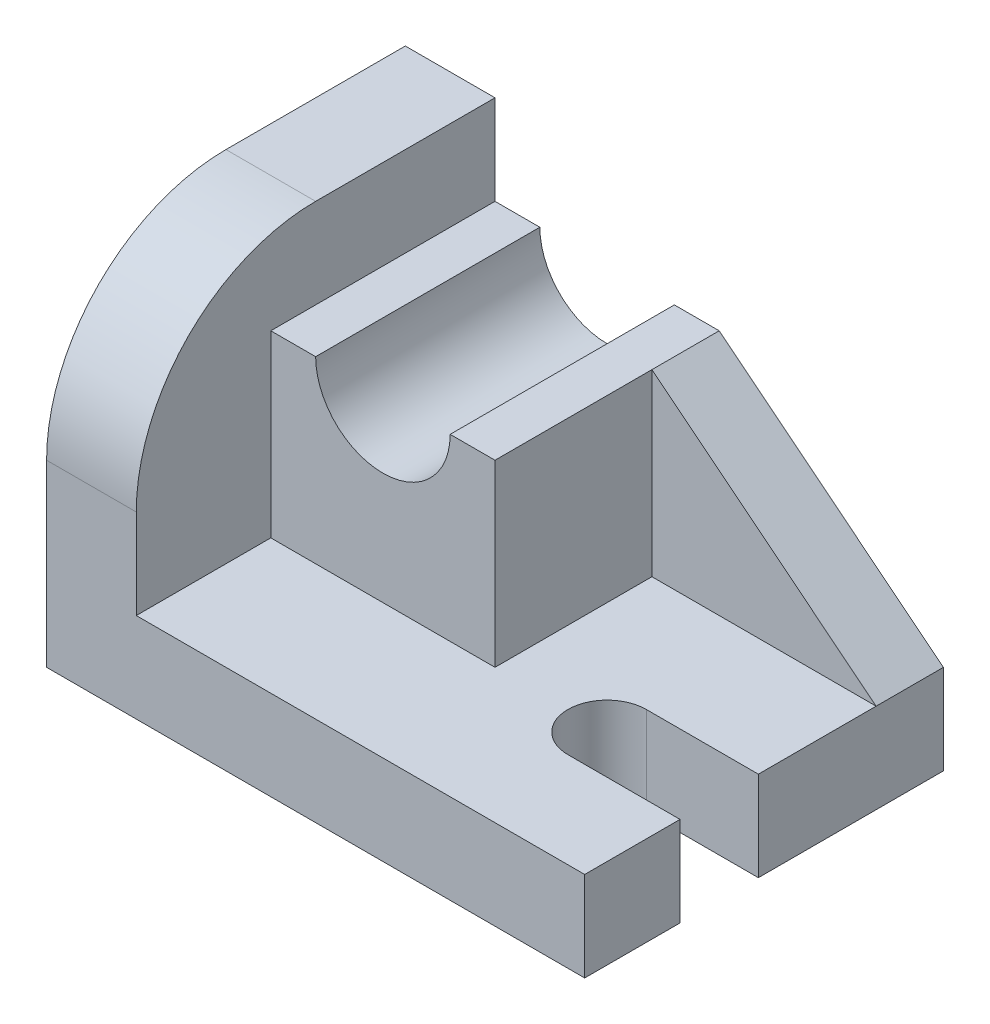
ISO-10303-21;
HEADER;
FILE_DESCRIPTION(('STEP AP214'),'2;1');
FILE_NAME('part.step','',(''),(''),'','','');
FILE_SCHEMA(('AUTOMOTIVE_DESIGN { 1 0 10303 214 1 1 1 1 }'));
ENDSEC;
DATA;
#1=APPLICATION_CONTEXT('core data for automotive mechanical design processes');
#2=APPLICATION_PROTOCOL_DEFINITION('international standard','automotive_design',2000,#1);
#3=PRODUCT_CONTEXT('',#1,'mechanical');
#4=PRODUCT('Part','Part','',(#3));
#5=PRODUCT_RELATED_PRODUCT_CATEGORY('part','',(#4));
#6=PRODUCT_DEFINITION_FORMATION('','',#4);
#7=PRODUCT_DEFINITION_CONTEXT('part definition',#1,'design');
#8=PRODUCT_DEFINITION('design','',#6,#7);
#9=PRODUCT_DEFINITION_SHAPE('','',#8);
#10=(LENGTH_UNIT() NAMED_UNIT(*) SI_UNIT(.MILLI.,.METRE.));
#11=(NAMED_UNIT(*) PLANE_ANGLE_UNIT() SI_UNIT($,.RADIAN.));
#12=(NAMED_UNIT(*) SI_UNIT($,.STERADIAN.) SOLID_ANGLE_UNIT());
#13=UNCERTAINTY_MEASURE_WITH_UNIT(LENGTH_MEASURE(1.E-05),#10,'distance_accuracy_value','');
#14=(GEOMETRIC_REPRESENTATION_CONTEXT(3) GLOBAL_UNCERTAINTY_ASSIGNED_CONTEXT((#13)) GLOBAL_UNIT_ASSIGNED_CONTEXT((#10,
#11,#12)) REPRESENTATION_CONTEXT('',''));
#15=CARTESIAN_POINT('',(0.,0.,0.));
#16=DIRECTION('',(0.,0.,1.));
#17=DIRECTION('',(1.,0.,0.));
#18=AXIS2_PLACEMENT_3D('',#15,#16,#17);
#19=CARTESIAN_POINT('',(96.,0.,64.));
#20=DIRECTION('',(-1.,0.,0.));
#21=DIRECTION('',(0.,0.,1.));
#22=AXIS2_PLACEMENT_3D('',#19,#20,#21);
#23=PLANE('',#22);
#24=DIRECTION('',(0.,-1.,0.));
#25=VECTOR('',#24,1.);
#26=CARTESIAN_POINT('',(96.,240.924225024706,33.0109807101342));
#27=LINE('',#26,#25);
#28=CARTESIAN_POINT('',(96.,16.,33.0109807101342));
#29=VERTEX_POINT('',#28);
#30=CARTESIAN_POINT('',(96.,0.,33.0109807101342));
#31=VERTEX_POINT('',#30);
#32=EDGE_CURVE('E190',#29,#31,#27,.T.);
#33=ORIENTED_EDGE('',*,*,#32,.T.);
#34=DIRECTION('',(0.,0.,-1.));
#35=VECTOR('',#34,1.);
#36=CARTESIAN_POINT('',(96.,0.,64.));
#37=LINE('',#36,#35);
#38=CARTESIAN_POINT('',(96.,0.,0.));
#39=VERTEX_POINT('',#38);
#40=EDGE_CURVE('E294',#31,#39,#37,.T.);
#41=ORIENTED_EDGE('',*,*,#40,.T.);
#42=DIRECTION('',(0.,1.,0.));
#43=VECTOR('',#42,1.);
#44=CARTESIAN_POINT('',(96.,0.,0.));
#45=LINE('',#44,#43);
#46=CARTESIAN_POINT('',(96.,16.,0.));
#47=VERTEX_POINT('',#46);
#48=EDGE_CURVE('E275',#39,#47,#45,.T.);
#49=ORIENTED_EDGE('',*,*,#48,.T.);
#50=DIRECTION('',(0.,0.,-1.));
#51=VECTOR('',#50,1.);
#52=CARTESIAN_POINT('',(96.,16.,12.));
#53=LINE('',#52,#51);
#54=CARTESIAN_POINT('',(96.,16.,12.));
#55=VERTEX_POINT('',#54);
#56=EDGE_CURVE('E213',#55,#47,#53,.T.);
#57=ORIENTED_EDGE('',*,*,#56,.F.);
#58=DIRECTION('',(0.,0.,-1.));
#59=VECTOR('',#58,1.);
#60=CARTESIAN_POINT('',(96.,16.,64.));
#61=LINE('',#60,#59);
#62=EDGE_CURVE('E329',#29,#55,#61,.T.);
#63=ORIENTED_EDGE('',*,*,#62,.F.);
#64=EDGE_LOOP('',(#33,#41,#49,#57,#63));
#65=FACE_BOUND('',#64,.T.);
#66=ADVANCED_FACE('F43',(#65),#23,.F.);
#67=DIRECTION('',(0.,-1.,0.));
#68=VECTOR('',#67,1.);
#69=CARTESIAN_POINT('',(96.,240.924225024706,46.9890192898658));
#70=LINE('',#69,#68);
#71=CARTESIAN_POINT('',(96.,16.,46.9890192898658));
#72=VERTEX_POINT('',#71);
#73=CARTESIAN_POINT('',(96.,0.,46.9890192898658));
#74=VERTEX_POINT('',#73);
#75=EDGE_CURVE('E177',#72,#74,#70,.T.);
#76=ORIENTED_EDGE('',*,*,#75,.F.);
#77=CARTESIAN_POINT('',(96.,16.,64.));
#78=VERTEX_POINT('',#77);
#79=EDGE_CURVE('E330',#78,#72,#61,.T.);
#80=ORIENTED_EDGE('',*,*,#79,.F.);
#81=DIRECTION('',(0.,1.,0.));
#82=VECTOR('',#81,1.);
#83=CARTESIAN_POINT('',(96.,0.,64.));
#84=LINE('',#83,#82);
#85=CARTESIAN_POINT('',(96.,0.,64.));
#86=VERTEX_POINT('',#85);
#87=EDGE_CURVE('E276',#86,#78,#84,.T.);
#88=ORIENTED_EDGE('',*,*,#87,.F.);
#89=EDGE_CURVE('E312',#86,#74,#37,.T.);
#90=ORIENTED_EDGE('',*,*,#89,.T.);
#91=EDGE_LOOP('',(#76,#80,#88,#90));
#92=FACE_BOUND('',#91,.T.);
#93=ADVANCED_FACE('F387',(#92),#23,.F.);
#94=CARTESIAN_POINT('',(0.,16.,64.));
#95=DIRECTION('',(0.,-1.,0.));
#96=DIRECTION('',(0.,0.,-1.));
#97=AXIS2_PLACEMENT_3D('',#94,#95,#96);
#98=PLANE('',#97);
#99=DIRECTION('',(-1.,0.,0.));
#100=VECTOR('',#99,1.);
#101=CARTESIAN_POINT('',(0.,16.,33.0109807101342));
#102=LINE('',#101,#100);
#103=CARTESIAN_POINT('',(76.,16.,33.0109807101342));
#104=VERTEX_POINT('',#103);
#105=EDGE_CURVE('E198',#29,#104,#102,.T.);
#106=ORIENTED_EDGE('',*,*,#105,.F.);
#107=ORIENTED_EDGE('',*,*,#62,.T.);
#108=DIRECTION('',(-1.,0.,0.));
#109=VECTOR('',#108,1.);
#110=CARTESIAN_POINT('',(0.,16.,12.));
#111=LINE('',#110,#109);
#112=CARTESIAN_POINT('',(56.,16.,12.));
#113=VERTEX_POINT('',#112);
#114=EDGE_CURVE('E209',#55,#113,#111,.T.);
#115=ORIENTED_EDGE('',*,*,#114,.T.);
#116=DIRECTION('',(0.,0.,-1.));
#117=VECTOR('',#116,1.);
#118=CARTESIAN_POINT('',(56.,16.,40.));
#119=LINE('',#118,#117);
#120=CARTESIAN_POINT('',(56.,16.,40.));
#121=VERTEX_POINT('',#120);
#122=EDGE_CURVE('E265',#121,#113,#119,.T.);
#123=ORIENTED_EDGE('',*,*,#122,.F.);
#124=DIRECTION('',(-1.,0.,0.));
#125=VECTOR('',#124,1.);
#126=CARTESIAN_POINT('',(0.,16.,40.));
#127=LINE('',#126,#125);
#128=CARTESIAN_POINT('',(16.,16.,40.));
#129=VERTEX_POINT('',#128);
#130=EDGE_CURVE('E237',#121,#129,#127,.T.);
#131=ORIENTED_EDGE('',*,*,#130,.T.);
#132=DIRECTION('',(0.,0.,-1.));
#133=VECTOR('',#132,1.);
#134=CARTESIAN_POINT('',(16.,16.,64.));
#135=LINE('',#134,#133);
#136=CARTESIAN_POINT('',(16.,16.,64.));
#137=VERTEX_POINT('',#136);
#138=EDGE_CURVE('E325',#137,#129,#135,.T.);
#139=ORIENTED_EDGE('',*,*,#138,.F.);
#140=DIRECTION('',(-1.,0.,0.));
#141=VECTOR('',#140,1.);
#142=CARTESIAN_POINT('',(0.,16.,64.));
#143=LINE('',#142,#141);
#144=EDGE_CURVE('E280',#78,#137,#143,.T.);
#145=ORIENTED_EDGE('',*,*,#144,.F.);
#146=ORIENTED_EDGE('',*,*,#79,.T.);
#147=DIRECTION('',(1.,0.,0.));
#148=VECTOR('',#147,1.);
#149=CARTESIAN_POINT('',(0.,16.,46.9890192898658));
#150=LINE('',#149,#148);
#151=CARTESIAN_POINT('',(76.,16.,46.9890192898658));
#152=VERTEX_POINT('',#151);
#153=EDGE_CURVE('E64',#152,#72,#150,.T.);
#154=ORIENTED_EDGE('',*,*,#153,.F.);
#155=CARTESIAN_POINT('',(76.,16.,40.));
#156=DIRECTION('',(0.,-1.,0.));
#157=DIRECTION('',(0.,0.,-1.));
#158=AXIS2_PLACEMENT_3D('',#155,#156,#157);
#159=CIRCLE('',#158,6.98901928986576);
#160=EDGE_CURVE('E59',#104,#152,#159,.F.);
#161=ORIENTED_EDGE('',*,*,#160,.F.);
#162=EDGE_LOOP('',(#106,#107,#115,#123,#131,#139,#145,#146,#154,#161));
#163=FACE_BOUND('',#162,.T.);
#164=ADVANCED_FACE('F360',(#163),#98,.F.);
#165=CARTESIAN_POINT('',(0.,0.,64.));
#166=DIRECTION('',(0.,1.,0.));
#167=DIRECTION('',(0.,0.,1.));
#168=AXIS2_PLACEMENT_3D('',#165,#166,#167);
#169=PLANE('',#168);
#170=DIRECTION('',(1.,0.,0.));
#171=VECTOR('',#170,1.);
#172=CARTESIAN_POINT('',(0.,0.,33.0109807101342));
#173=LINE('',#172,#171);
#174=CARTESIAN_POINT('',(76.,0.,33.0109807101342));
#175=VERTEX_POINT('',#174);
#176=EDGE_CURVE('E11',#175,#31,#173,.T.);
#177=ORIENTED_EDGE('',*,*,#176,.F.);
#178=CARTESIAN_POINT('',(76.,0.,40.));
#179=DIRECTION('',(0.,1.,0.));
#180=DIRECTION('',(0.,0.,1.));
#181=AXIS2_PLACEMENT_3D('',#178,#179,#180);
#182=CIRCLE('',#181,6.98901928986576);
#183=CARTESIAN_POINT('',(76.,0.,46.9890192898658));
#184=VERTEX_POINT('',#183);
#185=EDGE_CURVE('E52',#184,#175,#182,.F.);
#186=ORIENTED_EDGE('',*,*,#185,.F.);
#187=DIRECTION('',(-1.,0.,0.));
#188=VECTOR('',#187,1.);
#189=CARTESIAN_POINT('',(0.,0.,46.9890192898658));
#190=LINE('',#189,#188);
#191=EDGE_CURVE('E164',#74,#184,#190,.T.);
#192=ORIENTED_EDGE('',*,*,#191,.F.);
#193=ORIENTED_EDGE('',*,*,#89,.F.);
#194=DIRECTION('',(1.,0.,0.));
#195=VECTOR('',#194,1.);
#196=CARTESIAN_POINT('',(0.,0.,64.));
#197=LINE('',#196,#195);
#198=CARTESIAN_POINT('',(0.,0.,64.));
#199=VERTEX_POINT('',#198);
#200=EDGE_CURVE('E291',#199,#86,#197,.T.);
#201=ORIENTED_EDGE('',*,*,#200,.F.);
#202=DIRECTION('',(0.,0.,-1.));
#203=VECTOR('',#202,1.);
#204=CARTESIAN_POINT('',(0.,0.,64.));
#205=LINE('',#204,#203);
#206=CARTESIAN_POINT('',(0.,0.,0.));
#207=VERTEX_POINT('',#206);
#208=EDGE_CURVE('E315',#199,#207,#205,.T.);
#209=ORIENTED_EDGE('',*,*,#208,.T.);
#210=DIRECTION('',(1.,0.,0.));
#211=VECTOR('',#210,1.);
#212=CARTESIAN_POINT('',(0.,0.,0.));
#213=LINE('',#212,#211);
#214=EDGE_CURVE('E281',#207,#39,#213,.T.);
#215=ORIENTED_EDGE('',*,*,#214,.T.);
#216=ORIENTED_EDGE('',*,*,#40,.F.);
#217=EDGE_LOOP('',(#177,#186,#192,#193,#201,#209,#215,#216));
#218=FACE_BOUND('',#217,.T.);
#219=ADVANCED_FACE('F162',(#218),#169,.F.);
#220=CARTESIAN_POINT('',(0.,32.,32.));
#221=DIRECTION('',(1.,0.,0.));
#222=DIRECTION('',(0.,0.,-1.));
#223=AXIS2_PLACEMENT_3D('',#220,#221,#222);
#224=CYLINDRICAL_SURFACE('',#223,32.);
#225=DIRECTION('',(1.,0.,0.));
#226=VECTOR('',#225,1.);
#227=CARTESIAN_POINT('',(0.,64.,32.));
#228=LINE('',#227,#226);
#229=CARTESIAN_POINT('',(0.,64.,32.));
#230=VERTEX_POINT('',#229);
#231=CARTESIAN_POINT('',(16.,64.,32.));
#232=VERTEX_POINT('',#231);
#233=EDGE_CURVE('E333',#230,#232,#228,.T.);
#234=ORIENTED_EDGE('',*,*,#233,.F.);
#235=CARTESIAN_POINT('',(0.,32.,32.));
#236=DIRECTION('',(1.,0.,0.));
#237=DIRECTION('',(0.,1.,0.));
#238=AXIS2_PLACEMENT_3D('',#235,#236,#237);
#239=CIRCLE('',#238,32.);
#240=CARTESIAN_POINT('',(0.,32.,64.));
#241=VERTEX_POINT('',#240);
#242=EDGE_CURVE('E341',#241,#230,#239,.F.);
#243=ORIENTED_EDGE('',*,*,#242,.F.);
#244=DIRECTION('',(1.,0.,0.));
#245=VECTOR('',#244,1.);
#246=CARTESIAN_POINT('',(0.,32.,64.));
#247=LINE('',#246,#245);
#248=CARTESIAN_POINT('',(16.,32.,64.));
#249=VERTEX_POINT('',#248);
#250=EDGE_CURVE('E337',#249,#241,#247,.F.);
#251=ORIENTED_EDGE('',*,*,#250,.F.);
#252=CARTESIAN_POINT('',(16.,32.,32.));
#253=DIRECTION('',(1.,0.,0.));
#254=DIRECTION('',(0.,0.,-1.));
#255=AXIS2_PLACEMENT_3D('',#252,#253,#254);
#256=CIRCLE('',#255,32.);
#257=EDGE_CURVE('E179',#232,#249,#256,.T.);
#258=ORIENTED_EDGE('',*,*,#257,.F.);
#259=EDGE_LOOP('',(#234,#243,#251,#258));
#260=FACE_BOUND('',#259,.T.);
#261=ADVANCED_FACE('F45',(#260),#224,.T.);
#262=CARTESIAN_POINT('',(16.,0.,64.));
#263=DIRECTION('',(1.,0.,0.));
#264=DIRECTION('',(0.,0.,-1.));
#265=AXIS2_PLACEMENT_3D('',#262,#263,#264);
#266=PLANE('',#265);
#267=DIRECTION('',(0.,0.,-1.));
#268=VECTOR('',#267,1.);
#269=CARTESIAN_POINT('',(16.,64.,64.));
#270=LINE('',#269,#268);
#271=CARTESIAN_POINT('',(16.,64.,0.));
#272=VERTEX_POINT('',#271);
#273=EDGE_CURVE('E322',#232,#272,#270,.T.);
#274=ORIENTED_EDGE('',*,*,#273,.F.);
#275=ORIENTED_EDGE('',*,*,#257,.T.);
#276=DIRECTION('',(0.,-1.,0.));
#277=VECTOR('',#276,1.);
#278=CARTESIAN_POINT('',(16.,0.,64.));
#279=LINE('',#278,#277);
#280=EDGE_CURVE('E285',#249,#137,#279,.T.);
#281=ORIENTED_EDGE('',*,*,#280,.T.);
#282=ORIENTED_EDGE('',*,*,#138,.T.);
#283=DIRECTION('',(0.,-1.,0.));
#284=VECTOR('',#283,1.);
#285=CARTESIAN_POINT('',(16.,0.,40.));
#286=LINE('',#285,#284);
#287=CARTESIAN_POINT('',(16.,48.,40.));
#288=VERTEX_POINT('',#287);
#289=EDGE_CURVE('E233',#288,#129,#286,.T.);
#290=ORIENTED_EDGE('',*,*,#289,.F.);
#291=DIRECTION('',(0.,0.,-1.));
#292=VECTOR('',#291,1.);
#293=CARTESIAN_POINT('',(16.,48.,40.));
#294=LINE('',#293,#292);
#295=CARTESIAN_POINT('',(16.,48.,0.));
#296=VERTEX_POINT('',#295);
#297=EDGE_CURVE('E269',#288,#296,#294,.T.);
#298=ORIENTED_EDGE('',*,*,#297,.T.);
#299=DIRECTION('',(0.,-1.,0.));
#300=VECTOR('',#299,1.);
#301=CARTESIAN_POINT('',(16.,0.,0.));
#302=LINE('',#301,#300);
#303=EDGE_CURVE('E298',#272,#296,#302,.T.);
#304=ORIENTED_EDGE('',*,*,#303,.F.);
#305=EDGE_LOOP('',(#274,#275,#281,#282,#290,#298,#304));
#306=FACE_BOUND('',#305,.T.);
#307=ADVANCED_FACE('F349',(#306),#266,.T.);
#308=CARTESIAN_POINT('',(0.,64.,64.));
#309=DIRECTION('',(0.,1.,0.));
#310=DIRECTION('',(0.,0.,1.));
#311=AXIS2_PLACEMENT_3D('',#308,#309,#310);
#312=PLANE('',#311);
#313=DIRECTION('',(0.,0.,-1.));
#314=VECTOR('',#313,1.);
#315=CARTESIAN_POINT('',(0.,64.,64.));
#316=LINE('',#315,#314);
#317=CARTESIAN_POINT('',(0.,64.,0.));
#318=VERTEX_POINT('',#317);
#319=EDGE_CURVE('E319',#230,#318,#316,.T.);
#320=ORIENTED_EDGE('',*,*,#319,.F.);
#321=ORIENTED_EDGE('',*,*,#233,.T.);
#322=ORIENTED_EDGE('',*,*,#273,.T.);
#323=DIRECTION('',(1.,0.,0.));
#324=VECTOR('',#323,1.);
#325=CARTESIAN_POINT('',(0.,64.,0.));
#326=LINE('',#325,#324);
#327=EDGE_CURVE('E302',#318,#272,#326,.T.);
#328=ORIENTED_EDGE('',*,*,#327,.F.);
#329=EDGE_LOOP('',(#320,#321,#322,#328));
#330=FACE_BOUND('',#329,.T.);
#331=ADVANCED_FACE('F381',(#330),#312,.T.);
#332=CARTESIAN_POINT('',(0.,0.,64.));
#333=DIRECTION('',(1.,0.,0.));
#334=DIRECTION('',(0.,1.,0.));
#335=AXIS2_PLACEMENT_3D('',#332,#333,#334);
#336=PLANE('',#335);
#337=DIRECTION('',(0.,-1.,0.));
#338=VECTOR('',#337,1.);
#339=CARTESIAN_POINT('',(0.,0.,64.));
#340=LINE('',#339,#338);
#341=EDGE_CURVE('E288',#241,#199,#340,.T.);
#342=ORIENTED_EDGE('',*,*,#341,.F.);
#343=ORIENTED_EDGE('',*,*,#242,.T.);
#344=ORIENTED_EDGE('',*,*,#319,.T.);
#345=DIRECTION('',(0.,-1.,0.));
#346=VECTOR('',#345,1.);
#347=CARTESIAN_POINT('',(0.,0.,0.));
#348=LINE('',#347,#346);
#349=EDGE_CURVE('E306',#318,#207,#348,.T.);
#350=ORIENTED_EDGE('',*,*,#349,.T.);
#351=ORIENTED_EDGE('',*,*,#208,.F.);
#352=EDGE_LOOP('',(#342,#343,#344,#350,#351));
#353=FACE_BOUND('',#352,.T.);
#354=ADVANCED_FACE('F383',(#353),#336,.F.);
#355=CARTESIAN_POINT('',(0.,0.,64.));
#356=DIRECTION('',(0.,0.,1.));
#357=DIRECTION('',(1.,0.,0.));
#358=AXIS2_PLACEMENT_3D('',#355,#356,#357);
#359=PLANE('',#358);
#360=ORIENTED_EDGE('',*,*,#280,.F.);
#361=ORIENTED_EDGE('',*,*,#250,.T.);
#362=ORIENTED_EDGE('',*,*,#341,.T.);
#363=ORIENTED_EDGE('',*,*,#200,.T.);
#364=ORIENTED_EDGE('',*,*,#87,.T.);
#365=ORIENTED_EDGE('',*,*,#144,.T.);
#366=EDGE_LOOP('',(#360,#361,#362,#363,#364,#365));
#367=FACE_BOUND('',#366,.T.);
#368=ADVANCED_FACE('F356',(#367),#359,.T.);
#369=CARTESIAN_POINT('',(0.,0.,0.));
#370=DIRECTION('',(0.,0.,1.));
#371=DIRECTION('',(1.,0.,0.));
#372=AXIS2_PLACEMENT_3D('',#369,#370,#371);
#373=PLANE('',#372);
#374=ORIENTED_EDGE('',*,*,#48,.F.);
#375=ORIENTED_EDGE('',*,*,#214,.F.);
#376=ORIENTED_EDGE('',*,*,#349,.F.);
#377=ORIENTED_EDGE('',*,*,#327,.T.);
#378=ORIENTED_EDGE('',*,*,#303,.T.);
#379=DIRECTION('',(1.,0.,0.));
#380=VECTOR('',#379,1.);
#381=CARTESIAN_POINT('',(0.,48.,0.));
#382=LINE('',#381,#380);
#383=CARTESIAN_POINT('',(24.,48.,0.));
#384=VERTEX_POINT('',#383);
#385=EDGE_CURVE('E252',#296,#384,#382,.T.);
#386=ORIENTED_EDGE('',*,*,#385,.T.);
#387=CARTESIAN_POINT('',(36.,48.,0.));
#388=DIRECTION('',(0.,0.,1.));
#389=DIRECTION('',(1.,0.,0.));
#390=AXIS2_PLACEMENT_3D('',#387,#388,#389);
#391=CIRCLE('',#390,12.);
#392=CARTESIAN_POINT('',(48.,48.,0.));
#393=VERTEX_POINT('',#392);
#394=EDGE_CURVE('E223',#384,#393,#391,.T.);
#395=ORIENTED_EDGE('',*,*,#394,.T.);
#396=DIRECTION('',(1.,0.,0.));
#397=VECTOR('',#396,1.);
#398=CARTESIAN_POINT('',(0.,48.,0.));
#399=LINE('',#398,#397);
#400=CARTESIAN_POINT('',(56.,48.,0.));
#401=VERTEX_POINT('',#400);
#402=EDGE_CURVE('E229',#393,#401,#399,.T.);
#403=ORIENTED_EDGE('',*,*,#402,.T.);
#404=DIRECTION('',(0.78086880944303,-0.624695047554424,0.));
#405=VECTOR('',#404,1.);
#406=CARTESIAN_POINT('',(45.2682926829268,56.5853658536585,0.));
#407=LINE('',#406,#405);
#408=EDGE_CURVE('E201',#401,#47,#407,.T.);
#409=ORIENTED_EDGE('',*,*,#408,.T.);
#410=EDGE_LOOP('',(#374,#375,#376,#377,#378,#386,#395,#403,#409));
#411=FACE_BOUND('',#410,.T.);
#412=ADVANCED_FACE('F375',(#411),#373,.F.);
#413=CARTESIAN_POINT('',(36.,48.,40.));
#414=DIRECTION('',(0.,0.,-1.));
#415=DIRECTION('',(-1.,0.,0.));
#416=AXIS2_PLACEMENT_3D('',#413,#414,#415);
#417=CYLINDRICAL_SURFACE('',#416,12.);
#418=ORIENTED_EDGE('',*,*,#394,.F.);
#419=DIRECTION('',(0.,0.,-1.));
#420=VECTOR('',#419,1.);
#421=CARTESIAN_POINT('',(24.,48.,40.));
#422=LINE('',#421,#420);
#423=CARTESIAN_POINT('',(24.,48.,40.));
#424=VERTEX_POINT('',#423);
#425=EDGE_CURVE('E272',#424,#384,#422,.T.);
#426=ORIENTED_EDGE('',*,*,#425,.F.);
#427=CARTESIAN_POINT('',(36.,48.,40.));
#428=DIRECTION('',(0.,0.,1.));
#429=DIRECTION('',(1.,0.,0.));
#430=AXIS2_PLACEMENT_3D('',#427,#428,#429);
#431=CIRCLE('',#430,12.);
#432=CARTESIAN_POINT('',(48.,48.,40.));
#433=VERTEX_POINT('',#432);
#434=EDGE_CURVE('E224',#424,#433,#431,.T.);
#435=ORIENTED_EDGE('',*,*,#434,.T.);
#436=DIRECTION('',(0.,0.,-1.));
#437=VECTOR('',#436,1.);
#438=CARTESIAN_POINT('',(48.,48.,40.));
#439=LINE('',#438,#437);
#440=EDGE_CURVE('E248',#433,#393,#439,.T.);
#441=ORIENTED_EDGE('',*,*,#440,.T.);
#442=EDGE_LOOP('',(#418,#426,#435,#441));
#443=FACE_BOUND('',#442,.T.);
#444=ADVANCED_FACE('F406',(#443),#417,.F.);
#445=CARTESIAN_POINT('',(0.,48.,40.));
#446=DIRECTION('',(0.,1.,0.));
#447=DIRECTION('',(0.,0.,1.));
#448=AXIS2_PLACEMENT_3D('',#445,#446,#447);
#449=PLANE('',#448);
#450=ORIENTED_EDGE('',*,*,#385,.F.);
#451=ORIENTED_EDGE('',*,*,#297,.F.);
#452=DIRECTION('',(1.,0.,0.));
#453=VECTOR('',#452,1.);
#454=CARTESIAN_POINT('',(0.,48.,40.));
#455=LINE('',#454,#453);
#456=EDGE_CURVE('E228',#288,#424,#455,.T.);
#457=ORIENTED_EDGE('',*,*,#456,.T.);
#458=ORIENTED_EDGE('',*,*,#425,.T.);
#459=EDGE_LOOP('',(#450,#451,#457,#458));
#460=FACE_BOUND('',#459,.T.);
#461=ADVANCED_FACE('F371',(#460),#449,.T.);
#462=CARTESIAN_POINT('',(56.,0.,40.));
#463=DIRECTION('',(1.,0.,0.));
#464=DIRECTION('',(0.,0.,-1.));
#465=AXIS2_PLACEMENT_3D('',#462,#463,#464);
#466=PLANE('',#465);
#467=DIRECTION('',(0.,-1.,0.));
#468=VECTOR('',#467,1.);
#469=CARTESIAN_POINT('',(56.,0.,12.));
#470=LINE('',#469,#468);
#471=CARTESIAN_POINT('',(56.,48.,12.));
#472=VERTEX_POINT('',#471);
#473=EDGE_CURVE('E206',#472,#113,#470,.T.);
#474=ORIENTED_EDGE('',*,*,#473,.F.);
#475=DIRECTION('',(0.,0.,-1.));
#476=VECTOR('',#475,1.);
#477=CARTESIAN_POINT('',(56.,48.,40.));
#478=LINE('',#477,#476);
#479=CARTESIAN_POINT('',(56.,48.,40.));
#480=VERTEX_POINT('',#479);
#481=EDGE_CURVE('E261',#480,#472,#478,.T.);
#482=ORIENTED_EDGE('',*,*,#481,.F.);
#483=DIRECTION('',(0.,-1.,0.));
#484=VECTOR('',#483,1.);
#485=CARTESIAN_POINT('',(56.,0.,40.));
#486=LINE('',#485,#484);
#487=EDGE_CURVE('E240',#480,#121,#486,.T.);
#488=ORIENTED_EDGE('',*,*,#487,.T.);
#489=ORIENTED_EDGE('',*,*,#122,.T.);
#490=EDGE_LOOP('',(#474,#482,#488,#489));
#491=FACE_BOUND('',#490,.T.);
#492=ADVANCED_FACE('F414',(#491),#466,.T.);
#493=CARTESIAN_POINT('',(0.,48.,40.));
#494=DIRECTION('',(0.,1.,0.));
#495=DIRECTION('',(0.,0.,1.));
#496=AXIS2_PLACEMENT_3D('',#493,#494,#495);
#497=PLANE('',#496);
#498=ORIENTED_EDGE('',*,*,#402,.F.);
#499=ORIENTED_EDGE('',*,*,#440,.F.);
#500=DIRECTION('',(1.,0.,0.));
#501=VECTOR('',#500,1.);
#502=CARTESIAN_POINT('',(0.,48.,40.));
#503=LINE('',#502,#501);
#504=EDGE_CURVE('E244',#433,#480,#503,.T.);
#505=ORIENTED_EDGE('',*,*,#504,.T.);
#506=ORIENTED_EDGE('',*,*,#481,.T.);
#507=DIRECTION('',(0.,0.,-1.));
#508=VECTOR('',#507,1.);
#509=CARTESIAN_POINT('',(56.,48.,12.));
#510=LINE('',#509,#508);
#511=EDGE_CURVE('E219',#472,#401,#510,.T.);
#512=ORIENTED_EDGE('',*,*,#511,.T.);
#513=EDGE_LOOP('',(#498,#499,#505,#506,#512));
#514=FACE_BOUND('',#513,.T.);
#515=ADVANCED_FACE('F417',(#514),#497,.T.);
#516=CARTESIAN_POINT('',(0.,0.,40.));
#517=DIRECTION('',(0.,0.,1.));
#518=DIRECTION('',(1.,0.,0.));
#519=AXIS2_PLACEMENT_3D('',#516,#517,#518);
#520=PLANE('',#519);
#521=ORIENTED_EDGE('',*,*,#434,.F.);
#522=ORIENTED_EDGE('',*,*,#456,.F.);
#523=ORIENTED_EDGE('',*,*,#289,.T.);
#524=ORIENTED_EDGE('',*,*,#130,.F.);
#525=ORIENTED_EDGE('',*,*,#487,.F.);
#526=ORIENTED_EDGE('',*,*,#504,.F.);
#527=EDGE_LOOP('',(#521,#522,#523,#524,#525,#526));
#528=FACE_BOUND('',#527,.T.);
#529=ADVANCED_FACE('F366',(#528),#520,.T.);
#530=CARTESIAN_POINT('',(45.2682926829268,56.5853658536585,12.));
#531=DIRECTION('',(0.624695047554424,0.78086880944303,0.));
#532=DIRECTION('',(-0.78086880944303,0.624695047554424,0.));
#533=AXIS2_PLACEMENT_3D('',#530,#531,#532);
#534=PLANE('',#533);
#535=ORIENTED_EDGE('',*,*,#408,.F.);
#536=ORIENTED_EDGE('',*,*,#511,.F.);
#537=DIRECTION('',(0.78086880944303,-0.624695047554424,0.));
#538=VECTOR('',#537,1.);
#539=CARTESIAN_POINT('',(45.2682926829268,56.5853658536585,12.));
#540=LINE('',#539,#538);
#541=EDGE_CURVE('E202',#472,#55,#540,.T.);
#542=ORIENTED_EDGE('',*,*,#541,.T.);
#543=ORIENTED_EDGE('',*,*,#56,.T.);
#544=EDGE_LOOP('',(#535,#536,#542,#543));
#545=FACE_BOUND('',#544,.T.);
#546=ADVANCED_FACE('F424',(#545),#534,.T.);
#547=CARTESIAN_POINT('',(0.,0.,12.));
#548=DIRECTION('',(0.,0.,1.));
#549=DIRECTION('',(1.,0.,0.));
#550=AXIS2_PLACEMENT_3D('',#547,#548,#549);
#551=PLANE('',#550);
#552=ORIENTED_EDGE('',*,*,#541,.F.);
#553=ORIENTED_EDGE('',*,*,#473,.T.);
#554=ORIENTED_EDGE('',*,*,#114,.F.);
#555=EDGE_LOOP('',(#552,#553,#554));
#556=FACE_BOUND('',#555,.T.);
#557=ADVANCED_FACE('F427',(#556),#551,.T.);
#558=CARTESIAN_POINT('',(76.,240.924225024706,33.0109807101342));
#559=DIRECTION('',(0.,0.,1.));
#560=DIRECTION('',(1.,0.,0.));
#561=AXIS2_PLACEMENT_3D('',#558,#559,#560);
#562=PLANE('',#561);
#563=ORIENTED_EDGE('',*,*,#32,.F.);
#564=ORIENTED_EDGE('',*,*,#105,.T.);
#565=DIRECTION('',(0.,-1.,0.));
#566=VECTOR('',#565,1.);
#567=CARTESIAN_POINT('',(76.,240.924225024706,33.0109807101342));
#568=LINE('',#567,#566);
#569=EDGE_CURVE('E187',#104,#175,#568,.T.);
#570=ORIENTED_EDGE('',*,*,#569,.T.);
#571=ORIENTED_EDGE('',*,*,#176,.T.);
#572=EDGE_LOOP('',(#563,#564,#570,#571));
#573=FACE_BOUND('',#572,.T.);
#574=ADVANCED_FACE('F431',(#573),#562,.T.);
#575=CARTESIAN_POINT('',(76.,240.924225024706,40.));
#576=DIRECTION('',(0.,-1.,0.));
#577=DIRECTION('',(0.,0.,-1.));
#578=AXIS2_PLACEMENT_3D('',#575,#576,#577);
#579=CYLINDRICAL_SURFACE('',#578,6.98901928986576);
#580=ORIENTED_EDGE('',*,*,#569,.F.);
#581=ORIENTED_EDGE('',*,*,#160,.T.);
#582=DIRECTION('',(0.,-1.,0.));
#583=VECTOR('',#582,1.);
#584=CARTESIAN_POINT('',(76.,240.924225024706,46.9890192898658));
#585=LINE('',#584,#583);
#586=EDGE_CURVE('E176',#152,#184,#585,.T.);
#587=ORIENTED_EDGE('',*,*,#586,.T.);
#588=ORIENTED_EDGE('',*,*,#185,.T.);
#589=EDGE_LOOP('',(#580,#581,#587,#588));
#590=FACE_BOUND('',#589,.T.);
#591=ADVANCED_FACE('F181',(#590),#579,.F.);
#592=CARTESIAN_POINT('',(76.,240.924225024706,46.9890192898658));
#593=DIRECTION('',(0.,0.,-1.));
#594=DIRECTION('',(-1.,0.,0.));
#595=AXIS2_PLACEMENT_3D('',#592,#593,#594);
#596=PLANE('',#595);
#597=ORIENTED_EDGE('',*,*,#586,.F.);
#598=ORIENTED_EDGE('',*,*,#153,.T.);
#599=ORIENTED_EDGE('',*,*,#75,.T.);
#600=ORIENTED_EDGE('',*,*,#191,.T.);
#601=EDGE_LOOP('',(#597,#598,#599,#600));
#602=FACE_BOUND('',#601,.T.);
#603=ADVANCED_FACE('F175',(#602),#596,.T.);
#604=CLOSED_SHELL('',(#66,#93,#164,#219,#261,#307,#331,#354,#368,#412,#444,#461,#492,#515,#529,
#546,#557,#574,#591,#603));
#605=MANIFOLD_SOLID_BREP('B2',#604);
#606=ADVANCED_BREP_SHAPE_REPRESENTATION('',(#18,#605),#14);
#607=SHAPE_DEFINITION_REPRESENTATION(#9,#606);
ENDSEC;
END-ISO-10303-21;
